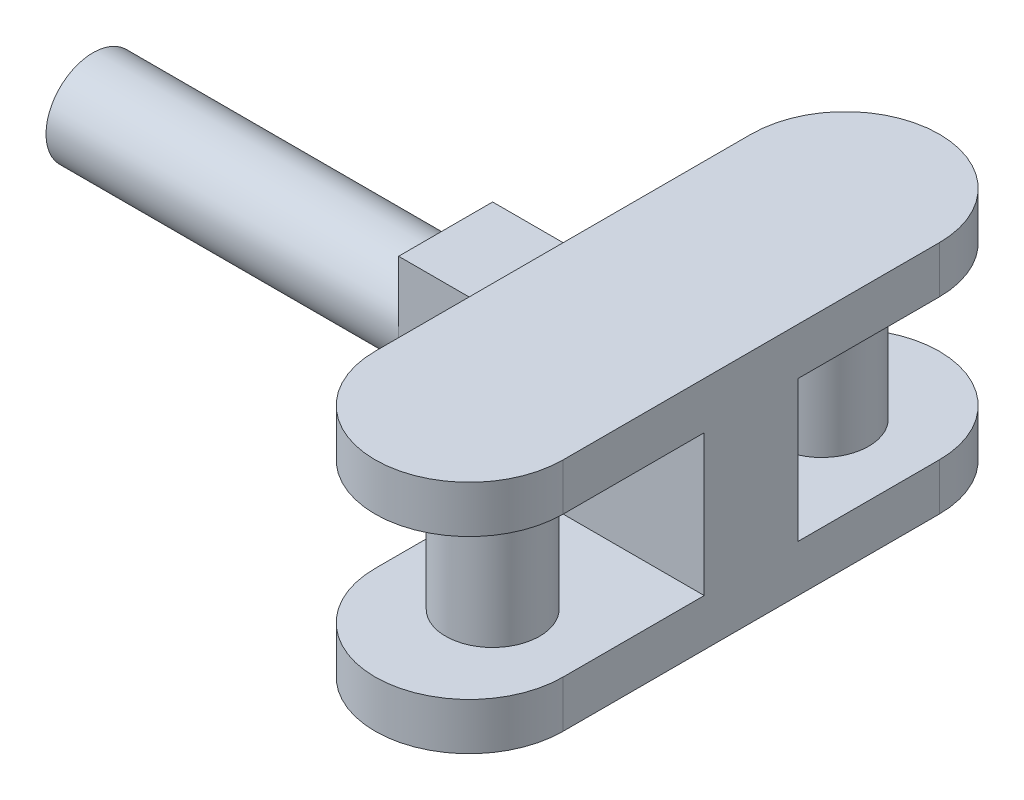
ISO-10303-21;
HEADER;
FILE_DESCRIPTION(('STEP AP214'),'2;1');
FILE_NAME('part.step','',(''),(''),'','','');
FILE_SCHEMA(('AUTOMOTIVE_DESIGN { 1 0 10303 214 1 1 1 1 }'));
ENDSEC;
DATA;
#1=APPLICATION_CONTEXT('core data for automotive mechanical design processes');
#2=APPLICATION_PROTOCOL_DEFINITION('international standard','automotive_design',2000,#1);
#3=PRODUCT_CONTEXT('',#1,'mechanical');
#4=PRODUCT('Part','Part','',(#3));
#5=PRODUCT_RELATED_PRODUCT_CATEGORY('part','',(#4));
#6=PRODUCT_DEFINITION_FORMATION('','',#4);
#7=PRODUCT_DEFINITION_CONTEXT('part definition',#1,'design');
#8=PRODUCT_DEFINITION('design','',#6,#7);
#9=PRODUCT_DEFINITION_SHAPE('','',#8);
#10=(LENGTH_UNIT() NAMED_UNIT(*) SI_UNIT(.MILLI.,.METRE.));
#11=(NAMED_UNIT(*) PLANE_ANGLE_UNIT() SI_UNIT($,.RADIAN.));
#12=(NAMED_UNIT(*) SI_UNIT($,.STERADIAN.) SOLID_ANGLE_UNIT());
#13=UNCERTAINTY_MEASURE_WITH_UNIT(LENGTH_MEASURE(1.E-05),#10,'distance_accuracy_value','');
#14=(GEOMETRIC_REPRESENTATION_CONTEXT(3) GLOBAL_UNCERTAINTY_ASSIGNED_CONTEXT((#13)) GLOBAL_UNIT_ASSIGNED_CONTEXT((#10,
#11,#12)) REPRESENTATION_CONTEXT('',''));
#15=CARTESIAN_POINT('',(0.,0.,0.));
#16=DIRECTION('',(0.,0.,1.));
#17=DIRECTION('',(1.,0.,0.));
#18=AXIS2_PLACEMENT_3D('',#15,#16,#17);
#19=CARTESIAN_POINT('',(0.,10.,0.));
#20=DIRECTION('',(1.,0.,0.));
#21=DIRECTION('',(0.,0.,-1.));
#22=AXIS2_PLACEMENT_3D('',#19,#20,#21);
#23=PLANE('',#22);
#24=DIRECTION('',(0.,0.,1.));
#25=VECTOR('',#24,1.);
#26=CARTESIAN_POINT('',(0.,2.,-14.));
#27=LINE('',#26,#25);
#28=CARTESIAN_POINT('',(0.,2.,-14.));
#29=VERTEX_POINT('',#28);
#30=CARTESIAN_POINT('',(0.,2.,-10.));
#31=VERTEX_POINT('',#30);
#32=EDGE_CURVE('E286',#29,#31,#27,.T.);
#33=ORIENTED_EDGE('',*,*,#32,.F.);
#34=DIRECTION('',(0.,0.,-1.));
#35=VECTOR('',#34,1.);
#36=CARTESIAN_POINT('',(0.,2.,0.));
#37=LINE('',#36,#35);
#38=CARTESIAN_POINT('',(0.,2.,-20.));
#39=VERTEX_POINT('',#38);
#40=EDGE_CURVE('E202',#29,#39,#37,.T.);
#41=ORIENTED_EDGE('',*,*,#40,.T.);
#42=DIRECTION('',(0.,-1.,0.));
#43=VECTOR('',#42,1.);
#44=CARTESIAN_POINT('',(0.,10.,-20.));
#45=LINE('',#44,#43);
#46=CARTESIAN_POINT('',(0.,0.,-20.));
#47=VERTEX_POINT('',#46);
#48=EDGE_CURVE('E232',#39,#47,#45,.T.);
#49=ORIENTED_EDGE('',*,*,#48,.T.);
#50=DIRECTION('',(0.,0.,1.));
#51=VECTOR('',#50,1.);
#52=CARTESIAN_POINT('',(0.,0.,0.));
#53=LINE('',#52,#51);
#54=CARTESIAN_POINT('',(0.,0.,-4.));
#55=VERTEX_POINT('',#54);
#56=EDGE_CURVE('E210',#47,#55,#53,.T.);
#57=ORIENTED_EDGE('',*,*,#56,.T.);
#58=DIRECTION('',(0.,-1.,0.));
#59=VECTOR('',#58,1.);
#60=CARTESIAN_POINT('',(0.,10.,-4.));
#61=LINE('',#60,#59);
#62=CARTESIAN_POINT('',(0.,2.,-4.));
#63=VERTEX_POINT('',#62);
#64=EDGE_CURVE('E263',#55,#63,#61,.F.);
#65=ORIENTED_EDGE('',*,*,#64,.T.);
#66=DIRECTION('',(0.,0.,-1.));
#67=VECTOR('',#66,1.);
#68=CARTESIAN_POINT('',(0.,2.,0.));
#69=LINE('',#68,#67);
#70=EDGE_CURVE('E205',#63,#31,#69,.T.);
#71=ORIENTED_EDGE('',*,*,#70,.T.);
#72=EDGE_LOOP('',(#33,#41,#49,#57,#65,#71));
#73=FACE_BOUND('',#72,.T.);
#74=ADVANCED_FACE('F35',(#73),#23,.F.);
#75=DIRECTION('',(0.,0.,-1.));
#76=VECTOR('',#75,1.);
#77=CARTESIAN_POINT('',(0.,8.,-14.));
#78=LINE('',#77,#76);
#79=CARTESIAN_POINT('',(0.,8.,-10.));
#80=VERTEX_POINT('',#79);
#81=CARTESIAN_POINT('',(0.,8.,-14.));
#82=VERTEX_POINT('',#81);
#83=EDGE_CURVE('E153',#80,#82,#78,.T.);
#84=ORIENTED_EDGE('',*,*,#83,.F.);
#85=DIRECTION('',(0.,0.,1.));
#86=VECTOR('',#85,1.);
#87=CARTESIAN_POINT('',(0.,8.,0.));
#88=LINE('',#87,#86);
#89=CARTESIAN_POINT('',(0.,8.,-4.));
#90=VERTEX_POINT('',#89);
#91=EDGE_CURVE('E207',#80,#90,#88,.T.);
#92=ORIENTED_EDGE('',*,*,#91,.T.);
#93=DIRECTION('',(0.,-1.,0.));
#94=VECTOR('',#93,1.);
#95=CARTESIAN_POINT('',(0.,10.,-4.));
#96=LINE('',#95,#94);
#97=CARTESIAN_POINT('',(0.,10.,-4.));
#98=VERTEX_POINT('',#97);
#99=EDGE_CURVE('E253',#90,#98,#96,.F.);
#100=ORIENTED_EDGE('',*,*,#99,.T.);
#101=DIRECTION('',(0.,0.,1.));
#102=VECTOR('',#101,1.);
#103=CARTESIAN_POINT('',(0.,10.,0.));
#104=LINE('',#103,#102);
#105=CARTESIAN_POINT('',(0.,10.,-20.));
#106=VERTEX_POINT('',#105);
#107=EDGE_CURVE('E211',#106,#98,#104,.T.);
#108=ORIENTED_EDGE('',*,*,#107,.F.);
#109=DIRECTION('',(0.,-1.,0.));
#110=VECTOR('',#109,1.);
#111=CARTESIAN_POINT('',(0.,10.,-20.));
#112=LINE('',#111,#110);
#113=CARTESIAN_POINT('',(0.,8.,-20.));
#114=VERTEX_POINT('',#113);
#115=EDGE_CURVE('E243',#106,#114,#112,.T.);
#116=ORIENTED_EDGE('',*,*,#115,.T.);
#117=DIRECTION('',(0.,0.,1.));
#118=VECTOR('',#117,1.);
#119=CARTESIAN_POINT('',(0.,8.,0.));
#120=LINE('',#119,#118);
#121=EDGE_CURVE('E189',#114,#82,#120,.T.);
#122=ORIENTED_EDGE('',*,*,#121,.T.);
#123=EDGE_LOOP('',(#84,#92,#100,#108,#116,#122));
#124=FACE_BOUND('',#123,.T.);
#125=ADVANCED_FACE('F303',(#124),#23,.F.);
#126=CARTESIAN_POINT('',(4.,0.,-4.));
#127=DIRECTION('',(0.,-1.,0.));
#128=DIRECTION('',(0.,0.,-1.));
#129=AXIS2_PLACEMENT_3D('',#126,#127,#128);
#130=CYLINDRICAL_SURFACE('',#129,4.);
#131=ORIENTED_EDGE('',*,*,#64,.F.);
#132=CARTESIAN_POINT('',(4.,0.,-4.));
#133=DIRECTION('',(0.,-1.,0.));
#134=DIRECTION('',(0.,0.,-1.));
#135=AXIS2_PLACEMENT_3D('',#132,#133,#134);
#136=CIRCLE('',#135,4.);
#137=CARTESIAN_POINT('',(8.,0.,-4.));
#138=VERTEX_POINT('',#137);
#139=EDGE_CURVE('E59',#138,#55,#136,.T.);
#140=ORIENTED_EDGE('',*,*,#139,.F.);
#141=DIRECTION('',(0.,-1.,0.));
#142=VECTOR('',#141,1.);
#143=CARTESIAN_POINT('',(8.,10.,-4.));
#144=LINE('',#143,#142);
#145=CARTESIAN_POINT('',(8.,2.,-4.));
#146=VERTEX_POINT('',#145);
#147=EDGE_CURVE('E266',#146,#138,#144,.T.);
#148=ORIENTED_EDGE('',*,*,#147,.F.);
#149=CARTESIAN_POINT('',(4.,2.,-4.));
#150=DIRECTION('',(0.,-1.,0.));
#151=DIRECTION('',(0.,0.,-1.));
#152=AXIS2_PLACEMENT_3D('',#149,#150,#151);
#153=CIRCLE('',#152,4.);
#154=EDGE_CURVE('E268',#63,#146,#153,.F.);
#155=ORIENTED_EDGE('',*,*,#154,.F.);
#156=EDGE_LOOP('',(#131,#140,#148,#155));
#157=FACE_BOUND('',#156,.T.);
#158=ADVANCED_FACE('F38',(#157),#130,.T.);
#159=CARTESIAN_POINT('',(4.,8.,-4.));
#160=DIRECTION('',(0.,-1.,0.));
#161=DIRECTION('',(0.,0.,-1.));
#162=AXIS2_PLACEMENT_3D('',#159,#160,#161);
#163=CYLINDRICAL_SURFACE('',#162,4.);
#164=ORIENTED_EDGE('',*,*,#99,.F.);
#165=CARTESIAN_POINT('',(4.,8.,-4.));
#166=DIRECTION('',(0.,1.,0.));
#167=DIRECTION('',(0.,0.,1.));
#168=AXIS2_PLACEMENT_3D('',#165,#166,#167);
#169=CIRCLE('',#168,4.);
#170=CARTESIAN_POINT('',(8.,8.,-4.));
#171=VERTEX_POINT('',#170);
#172=EDGE_CURVE('E259',#171,#90,#169,.F.);
#173=ORIENTED_EDGE('',*,*,#172,.F.);
#174=DIRECTION('',(0.,-1.,0.));
#175=VECTOR('',#174,1.);
#176=CARTESIAN_POINT('',(8.,10.,-4.));
#177=LINE('',#176,#175);
#178=CARTESIAN_POINT('',(8.,10.,-4.));
#179=VERTEX_POINT('',#178);
#180=EDGE_CURVE('E256',#179,#171,#177,.T.);
#181=ORIENTED_EDGE('',*,*,#180,.F.);
#182=CARTESIAN_POINT('',(4.,10.,-4.));
#183=DIRECTION('',(0.,-1.,0.));
#184=DIRECTION('',(0.,0.,-1.));
#185=AXIS2_PLACEMENT_3D('',#182,#183,#184);
#186=CIRCLE('',#185,4.);
#187=EDGE_CURVE('E261',#98,#179,#186,.F.);
#188=ORIENTED_EDGE('',*,*,#187,.F.);
#189=EDGE_LOOP('',(#164,#173,#181,#188));
#190=FACE_BOUND('',#189,.T.);
#191=ADVANCED_FACE('F327',(#190),#163,.T.);
#192=CARTESIAN_POINT('',(4.,10.,-20.));
#193=DIRECTION('',(0.,-1.,0.));
#194=DIRECTION('',(0.,0.,-1.));
#195=AXIS2_PLACEMENT_3D('',#192,#193,#194);
#196=CYLINDRICAL_SURFACE('',#195,4.);
#197=ORIENTED_EDGE('',*,*,#115,.F.);
#198=CARTESIAN_POINT('',(4.,10.,-20.));
#199=DIRECTION('',(0.,-1.,0.));
#200=DIRECTION('',(0.,0.,-1.));
#201=AXIS2_PLACEMENT_3D('',#198,#199,#200);
#202=CIRCLE('',#201,4.);
#203=CARTESIAN_POINT('',(8.,10.,-20.));
#204=VERTEX_POINT('',#203);
#205=EDGE_CURVE('E249',#204,#106,#202,.F.);
#206=ORIENTED_EDGE('',*,*,#205,.F.);
#207=DIRECTION('',(0.,-1.,0.));
#208=VECTOR('',#207,1.);
#209=CARTESIAN_POINT('',(8.,10.,-20.));
#210=LINE('',#209,#208);
#211=CARTESIAN_POINT('',(8.,8.,-20.));
#212=VERTEX_POINT('',#211);
#213=EDGE_CURVE('E246',#212,#204,#210,.F.);
#214=ORIENTED_EDGE('',*,*,#213,.F.);
#215=CARTESIAN_POINT('',(4.,8.,-20.));
#216=DIRECTION('',(0.,1.,0.));
#217=DIRECTION('',(0.,0.,1.));
#218=AXIS2_PLACEMENT_3D('',#215,#216,#217);
#219=CIRCLE('',#218,4.);
#220=EDGE_CURVE('E251',#114,#212,#219,.F.);
#221=ORIENTED_EDGE('',*,*,#220,.F.);
#222=EDGE_LOOP('',(#197,#206,#214,#221));
#223=FACE_BOUND('',#222,.T.);
#224=ADVANCED_FACE('F333',(#223),#196,.T.);
#225=CARTESIAN_POINT('',(4.,2.,-20.));
#226=DIRECTION('',(0.,-1.,0.));
#227=DIRECTION('',(0.,0.,-1.));
#228=AXIS2_PLACEMENT_3D('',#225,#226,#227);
#229=CYLINDRICAL_SURFACE('',#228,4.);
#230=ORIENTED_EDGE('',*,*,#48,.F.);
#231=CARTESIAN_POINT('',(4.,2.,-20.));
#232=DIRECTION('',(0.,-1.,0.));
#233=DIRECTION('',(0.,0.,-1.));
#234=AXIS2_PLACEMENT_3D('',#231,#232,#233);
#235=CIRCLE('',#234,4.);
#236=CARTESIAN_POINT('',(8.,2.,-20.));
#237=VERTEX_POINT('',#236);
#238=EDGE_CURVE('E238',#237,#39,#235,.F.);
#239=ORIENTED_EDGE('',*,*,#238,.F.);
#240=DIRECTION('',(0.,-1.,0.));
#241=VECTOR('',#240,1.);
#242=CARTESIAN_POINT('',(8.,10.,-20.));
#243=LINE('',#242,#241);
#244=CARTESIAN_POINT('',(8.,0.,-20.));
#245=VERTEX_POINT('',#244);
#246=EDGE_CURVE('E235',#245,#237,#243,.F.);
#247=ORIENTED_EDGE('',*,*,#246,.F.);
#248=CARTESIAN_POINT('',(4.,0.,-20.));
#249=DIRECTION('',(0.,-1.,0.));
#250=DIRECTION('',(0.,0.,-1.));
#251=AXIS2_PLACEMENT_3D('',#248,#249,#250);
#252=CIRCLE('',#251,4.);
#253=EDGE_CURVE('E240',#47,#245,#252,.T.);
#254=ORIENTED_EDGE('',*,*,#253,.F.);
#255=EDGE_LOOP('',(#230,#239,#247,#254));
#256=FACE_BOUND('',#255,.T.);
#257=ADVANCED_FACE('F335',(#256),#229,.T.);
#258=CARTESIAN_POINT('',(8.,10.,0.));
#259=DIRECTION('',(-1.,0.,0.));
#260=DIRECTION('',(0.,0.,1.));
#261=AXIS2_PLACEMENT_3D('',#258,#259,#260);
#262=PLANE('',#261);
#263=DIRECTION('',(0.,0.,-1.));
#264=VECTOR('',#263,1.);
#265=CARTESIAN_POINT('',(8.,2.,0.));
#266=LINE('',#265,#264);
#267=CARTESIAN_POINT('',(8.,2.,-10.));
#268=VERTEX_POINT('',#267);
#269=EDGE_CURVE('E178',#146,#268,#266,.T.);
#270=ORIENTED_EDGE('',*,*,#269,.F.);
#271=ORIENTED_EDGE('',*,*,#147,.T.);
#272=DIRECTION('',(0.,0.,-1.));
#273=VECTOR('',#272,1.);
#274=CARTESIAN_POINT('',(8.,0.,0.));
#275=LINE('',#274,#273);
#276=EDGE_CURVE('E215',#138,#245,#275,.T.);
#277=ORIENTED_EDGE('',*,*,#276,.T.);
#278=ORIENTED_EDGE('',*,*,#246,.T.);
#279=DIRECTION('',(0.,0.,-1.));
#280=VECTOR('',#279,1.);
#281=CARTESIAN_POINT('',(8.,2.,-24.));
#282=LINE('',#281,#280);
#283=CARTESIAN_POINT('',(8.,2.,-14.));
#284=VERTEX_POINT('',#283);
#285=EDGE_CURVE('E195',#284,#237,#282,.T.);
#286=ORIENTED_EDGE('',*,*,#285,.F.);
#287=DIRECTION('',(0.,-1.,0.));
#288=VECTOR('',#287,1.);
#289=CARTESIAN_POINT('',(8.,8.,-14.));
#290=LINE('',#289,#288);
#291=CARTESIAN_POINT('',(8.,8.,-14.));
#292=VERTEX_POINT('',#291);
#293=EDGE_CURVE('E193',#292,#284,#290,.T.);
#294=ORIENTED_EDGE('',*,*,#293,.F.);
#295=DIRECTION('',(0.,0.,1.));
#296=VECTOR('',#295,1.);
#297=CARTESIAN_POINT('',(8.,8.,-24.));
#298=LINE('',#297,#296);
#299=EDGE_CURVE('E172',#212,#292,#298,.T.);
#300=ORIENTED_EDGE('',*,*,#299,.F.);
#301=ORIENTED_EDGE('',*,*,#213,.T.);
#302=DIRECTION('',(0.,0.,-1.));
#303=VECTOR('',#302,1.);
#304=CARTESIAN_POINT('',(8.,10.,0.));
#305=LINE('',#304,#303);
#306=EDGE_CURVE('E214',#179,#204,#305,.T.);
#307=ORIENTED_EDGE('',*,*,#306,.F.);
#308=ORIENTED_EDGE('',*,*,#180,.T.);
#309=DIRECTION('',(0.,0.,1.));
#310=VECTOR('',#309,1.);
#311=CARTESIAN_POINT('',(8.,8.,0.));
#312=LINE('',#311,#310);
#313=CARTESIAN_POINT('',(8.,8.,-10.));
#314=VERTEX_POINT('',#313);
#315=EDGE_CURVE('E183',#314,#171,#312,.T.);
#316=ORIENTED_EDGE('',*,*,#315,.F.);
#317=DIRECTION('',(0.,1.,0.));
#318=VECTOR('',#317,1.);
#319=CARTESIAN_POINT('',(8.,8.,-10.));
#320=LINE('',#319,#318);
#321=EDGE_CURVE('E180',#268,#314,#320,.T.);
#322=ORIENTED_EDGE('',*,*,#321,.F.);
#323=EDGE_LOOP('',(#270,#271,#277,#278,#286,#294,#300,#301,#307,#308,#316,#322));
#324=FACE_BOUND('',#323,.T.);
#325=ADVANCED_FACE('F315',(#324),#262,.F.);
#326=CARTESIAN_POINT('',(0.,10.,0.));
#327=DIRECTION('',(0.,-1.,0.));
#328=DIRECTION('',(0.,0.,-1.));
#329=AXIS2_PLACEMENT_3D('',#326,#327,#328);
#330=PLANE('',#329);
#331=ORIENTED_EDGE('',*,*,#107,.T.);
#332=ORIENTED_EDGE('',*,*,#187,.T.);
#333=ORIENTED_EDGE('',*,*,#306,.T.);
#334=ORIENTED_EDGE('',*,*,#205,.T.);
#335=EDGE_LOOP('',(#331,#332,#333,#334));
#336=FACE_BOUND('',#335,.T.);
#337=ADVANCED_FACE('F329',(#336),#330,.F.);
#338=CARTESIAN_POINT('',(0.,0.,0.));
#339=DIRECTION('',(0.,-1.,0.));
#340=DIRECTION('',(0.,0.,-1.));
#341=AXIS2_PLACEMENT_3D('',#338,#339,#340);
#342=PLANE('',#341);
#343=ORIENTED_EDGE('',*,*,#276,.F.);
#344=ORIENTED_EDGE('',*,*,#139,.T.);
#345=ORIENTED_EDGE('',*,*,#56,.F.);
#346=ORIENTED_EDGE('',*,*,#253,.T.);
#347=EDGE_LOOP('',(#343,#344,#345,#346));
#348=FACE_BOUND('',#347,.T.);
#349=ADVANCED_FACE('F362',(#348),#342,.T.);
#350=CARTESIAN_POINT('',(-2.,8.,-14.));
#351=DIRECTION('',(0.,0.,1.));
#352=DIRECTION('',(0.,-1.,0.));
#353=AXIS2_PLACEMENT_3D('',#350,#351,#352);
#354=PLANE('',#353);
#355=DIRECTION('',(1.,0.,0.));
#356=VECTOR('',#355,1.);
#357=CARTESIAN_POINT('',(-2.,8.,-14.));
#358=LINE('',#357,#356);
#359=EDGE_CURVE('E198',#82,#292,#358,.T.);
#360=ORIENTED_EDGE('',*,*,#359,.T.);
#361=ORIENTED_EDGE('',*,*,#293,.T.);
#362=DIRECTION('',(1.,0.,0.));
#363=VECTOR('',#362,1.);
#364=CARTESIAN_POINT('',(-2.,2.,-14.));
#365=LINE('',#364,#363);
#366=EDGE_CURVE('E168',#29,#284,#365,.T.);
#367=ORIENTED_EDGE('',*,*,#366,.F.);
#368=DIRECTION('',(1.,0.,0.));
#369=VECTOR('',#368,1.);
#370=CARTESIAN_POINT('',(-5.,2.,-14.));
#371=LINE('',#370,#369);
#372=CARTESIAN_POINT('',(-5.,2.,-14.));
#373=VERTEX_POINT('',#372);
#374=EDGE_CURVE('E159',#373,#29,#371,.T.);
#375=ORIENTED_EDGE('',*,*,#374,.F.);
#376=DIRECTION('',(0.,-1.,0.));
#377=VECTOR('',#376,1.);
#378=CARTESIAN_POINT('',(-5.,8.,-14.));
#379=LINE('',#378,#377);
#380=CARTESIAN_POINT('',(-5.,5.,-14.));
#381=VERTEX_POINT('',#380);
#382=EDGE_CURVE('E142',#381,#373,#379,.T.);
#383=ORIENTED_EDGE('',*,*,#382,.F.);
#384=CARTESIAN_POINT('',(-5.,8.,-14.));
#385=VERTEX_POINT('',#384);
#386=EDGE_CURVE('E152',#385,#381,#379,.T.);
#387=ORIENTED_EDGE('',*,*,#386,.F.);
#388=DIRECTION('',(1.,0.,0.));
#389=VECTOR('',#388,1.);
#390=CARTESIAN_POINT('',(-5.,8.,-14.));
#391=LINE('',#390,#389);
#392=EDGE_CURVE('E285',#385,#82,#391,.T.);
#393=ORIENTED_EDGE('',*,*,#392,.T.);
#394=EDGE_LOOP('',(#360,#361,#367,#375,#383,#387,#393));
#395=FACE_BOUND('',#394,.T.);
#396=ADVANCED_FACE('F166',(#395),#354,.F.);
#397=CARTESIAN_POINT('',(-2.,2.,-24.));
#398=DIRECTION('',(0.,-1.,0.));
#399=DIRECTION('',(0.,0.,-1.));
#400=AXIS2_PLACEMENT_3D('',#397,#398,#399);
#401=PLANE('',#400);
#402=CARTESIAN_POINT('',(4.,2.,-19.));
#403=DIRECTION('',(0.,-1.,0.));
#404=DIRECTION('',(0.,0.,-1.));
#405=AXIS2_PLACEMENT_3D('',#402,#403,#404);
#406=CIRCLE('',#405,2.);
#407=CARTESIAN_POINT('',(4.,2.,-21.));
#408=VERTEX_POINT('',#407);
#409=EDGE_CURVE('E229',#408,#408,#406,.F.);
#410=ORIENTED_EDGE('',*,*,#409,.F.);
#411=EDGE_LOOP('',(#410));
#412=FACE_BOUND('',#411,.T.);
#413=ORIENTED_EDGE('',*,*,#285,.T.);
#414=ORIENTED_EDGE('',*,*,#238,.T.);
#415=ORIENTED_EDGE('',*,*,#40,.F.);
#416=ORIENTED_EDGE('',*,*,#366,.T.);
#417=EDGE_LOOP('',(#413,#414,#415,#416));
#418=FACE_BOUND('',#417,.T.);
#419=ADVANCED_FACE('F318',(#412,#418),#401,.F.);
#420=CARTESIAN_POINT('',(-2.,8.,-24.));
#421=DIRECTION('',(0.,1.,0.));
#422=DIRECTION('',(0.,0.,1.));
#423=AXIS2_PLACEMENT_3D('',#420,#421,#422);
#424=PLANE('',#423);
#425=CARTESIAN_POINT('',(4.,8.,-19.));
#426=DIRECTION('',(0.,1.,0.));
#427=DIRECTION('',(0.,0.,1.));
#428=AXIS2_PLACEMENT_3D('',#425,#426,#427);
#429=CIRCLE('',#428,2.);
#430=CARTESIAN_POINT('',(4.,8.,-17.));
#431=VERTEX_POINT('',#430);
#432=EDGE_CURVE('E226',#431,#431,#429,.F.);
#433=ORIENTED_EDGE('',*,*,#432,.F.);
#434=EDGE_LOOP('',(#433));
#435=FACE_BOUND('',#434,.T.);
#436=ORIENTED_EDGE('',*,*,#121,.F.);
#437=ORIENTED_EDGE('',*,*,#220,.T.);
#438=ORIENTED_EDGE('',*,*,#299,.T.);
#439=ORIENTED_EDGE('',*,*,#359,.F.);
#440=EDGE_LOOP('',(#436,#437,#438,#439));
#441=FACE_BOUND('',#440,.T.);
#442=ADVANCED_FACE('F309',(#435,#441),#424,.F.);
#443=CARTESIAN_POINT('',(-2.,8.,0.));
#444=DIRECTION('',(0.,1.,0.));
#445=DIRECTION('',(0.,0.,1.));
#446=AXIS2_PLACEMENT_3D('',#443,#444,#445);
#447=PLANE('',#446);
#448=CARTESIAN_POINT('',(4.,8.,-5.));
#449=DIRECTION('',(0.,1.,0.));
#450=DIRECTION('',(0.,0.,1.));
#451=AXIS2_PLACEMENT_3D('',#448,#449,#450);
#452=CIRCLE('',#451,2.);
#453=CARTESIAN_POINT('',(4.,8.,-3.));
#454=VERTEX_POINT('',#453);
#455=EDGE_CURVE('E223',#454,#454,#452,.F.);
#456=ORIENTED_EDGE('',*,*,#455,.F.);
#457=EDGE_LOOP('',(#456));
#458=FACE_BOUND('',#457,.T.);
#459=ORIENTED_EDGE('',*,*,#315,.T.);
#460=ORIENTED_EDGE('',*,*,#172,.T.);
#461=ORIENTED_EDGE('',*,*,#91,.F.);
#462=DIRECTION('',(1.,0.,0.));
#463=VECTOR('',#462,1.);
#464=CARTESIAN_POINT('',(-2.,8.,-10.));
#465=LINE('',#464,#463);
#466=EDGE_CURVE('E187',#80,#314,#465,.T.);
#467=ORIENTED_EDGE('',*,*,#466,.T.);
#468=EDGE_LOOP('',(#459,#460,#461,#467));
#469=FACE_BOUND('',#468,.T.);
#470=ADVANCED_FACE('F300',(#458,#469),#447,.F.);
#471=CARTESIAN_POINT('',(-2.,8.,-10.));
#472=DIRECTION('',(0.,0.,-1.));
#473=DIRECTION('',(0.,1.,0.));
#474=AXIS2_PLACEMENT_3D('',#471,#472,#473);
#475=PLANE('',#474);
#476=DIRECTION('',(1.,0.,0.));
#477=VECTOR('',#476,1.);
#478=CARTESIAN_POINT('',(-2.,2.,-10.));
#479=LINE('',#478,#477);
#480=EDGE_CURVE('E186',#31,#268,#479,.T.);
#481=ORIENTED_EDGE('',*,*,#480,.T.);
#482=ORIENTED_EDGE('',*,*,#321,.T.);
#483=ORIENTED_EDGE('',*,*,#466,.F.);
#484=DIRECTION('',(1.,0.,0.));
#485=VECTOR('',#484,1.);
#486=CARTESIAN_POINT('',(-5.,8.,-10.));
#487=LINE('',#486,#485);
#488=CARTESIAN_POINT('',(-5.,8.,-10.));
#489=VERTEX_POINT('',#488);
#490=EDGE_CURVE('E174',#489,#80,#487,.T.);
#491=ORIENTED_EDGE('',*,*,#490,.F.);
#492=DIRECTION('',(0.,1.,0.));
#493=VECTOR('',#492,1.);
#494=CARTESIAN_POINT('',(-5.,8.,-10.));
#495=LINE('',#494,#493);
#496=CARTESIAN_POINT('',(-5.,5.,-10.));
#497=VERTEX_POINT('',#496);
#498=EDGE_CURVE('E162',#497,#489,#495,.T.);
#499=ORIENTED_EDGE('',*,*,#498,.F.);
#500=CARTESIAN_POINT('',(-5.,2.,-10.));
#501=VERTEX_POINT('',#500);
#502=EDGE_CURVE('E51',#501,#497,#495,.T.);
#503=ORIENTED_EDGE('',*,*,#502,.F.);
#504=DIRECTION('',(1.,0.,0.));
#505=VECTOR('',#504,1.);
#506=CARTESIAN_POINT('',(-5.,2.,-10.));
#507=LINE('',#506,#505);
#508=EDGE_CURVE('E161',#501,#31,#507,.T.);
#509=ORIENTED_EDGE('',*,*,#508,.T.);
#510=EDGE_LOOP('',(#481,#482,#483,#491,#499,#503,#509));
#511=FACE_BOUND('',#510,.T.);
#512=ADVANCED_FACE('F295',(#511),#475,.F.);
#513=CARTESIAN_POINT('',(-2.,2.,0.));
#514=DIRECTION('',(0.,-1.,0.));
#515=DIRECTION('',(0.,0.,-1.));
#516=AXIS2_PLACEMENT_3D('',#513,#514,#515);
#517=PLANE('',#516);
#518=CARTESIAN_POINT('',(4.,2.,-5.));
#519=DIRECTION('',(0.,-1.,0.));
#520=DIRECTION('',(0.,0.,-1.));
#521=AXIS2_PLACEMENT_3D('',#518,#519,#520);
#522=CIRCLE('',#521,2.);
#523=CARTESIAN_POINT('',(4.,2.,-7.));
#524=VERTEX_POINT('',#523);
#525=EDGE_CURVE('E217',#524,#524,#522,.F.);
#526=ORIENTED_EDGE('',*,*,#525,.F.);
#527=EDGE_LOOP('',(#526));
#528=FACE_BOUND('',#527,.T.);
#529=ORIENTED_EDGE('',*,*,#70,.F.);
#530=ORIENTED_EDGE('',*,*,#154,.T.);
#531=ORIENTED_EDGE('',*,*,#269,.T.);
#532=ORIENTED_EDGE('',*,*,#480,.F.);
#533=EDGE_LOOP('',(#529,#530,#531,#532));
#534=FACE_BOUND('',#533,.T.);
#535=ADVANCED_FACE('F376',(#528,#534),#517,.F.);
#536=CARTESIAN_POINT('',(4.,8.,-5.));
#537=DIRECTION('',(0.,-1.,0.));
#538=DIRECTION('',(0.,0.,-1.));
#539=AXIS2_PLACEMENT_3D('',#536,#537,#538);
#540=CYLINDRICAL_SURFACE('',#539,2.);
#541=ORIENTED_EDGE('',*,*,#455,.T.);
#542=EDGE_LOOP('',(#541));
#543=FACE_BOUND('',#542,.T.);
#544=ORIENTED_EDGE('',*,*,#525,.T.);
#545=EDGE_LOOP('',(#544));
#546=FACE_BOUND('',#545,.T.);
#547=ADVANCED_FACE('F379',(#543,#546),#540,.T.);
#548=CARTESIAN_POINT('',(4.,8.,-19.));
#549=DIRECTION('',(0.,-1.,0.));
#550=DIRECTION('',(0.,0.,-1.));
#551=AXIS2_PLACEMENT_3D('',#548,#549,#550);
#552=CYLINDRICAL_SURFACE('',#551,2.);
#553=ORIENTED_EDGE('',*,*,#432,.T.);
#554=EDGE_LOOP('',(#553));
#555=FACE_BOUND('',#554,.T.);
#556=ORIENTED_EDGE('',*,*,#409,.T.);
#557=EDGE_LOOP('',(#556));
#558=FACE_BOUND('',#557,.T.);
#559=ADVANCED_FACE('F388',(#555,#558),#552,.T.);
#560=CARTESIAN_POINT('',(-5.,0.,0.));
#561=DIRECTION('',(-1.,0.,0.));
#562=DIRECTION('',(0.,0.,1.));
#563=AXIS2_PLACEMENT_3D('',#560,#561,#562);
#564=PLANE('',#563);
#565=CARTESIAN_POINT('',(-5.,5.,-12.));
#566=DIRECTION('',(-1.,0.,0.));
#567=DIRECTION('',(0.,0.,1.));
#568=AXIS2_PLACEMENT_3D('',#565,#566,#567);
#569=CIRCLE('',#568,2.);
#570=EDGE_CURVE('E11',#497,#381,#569,.T.);
#571=ORIENTED_EDGE('',*,*,#570,.F.);
#572=ORIENTED_EDGE('',*,*,#498,.T.);
#573=DIRECTION('',(0.,0.,-1.));
#574=VECTOR('',#573,1.);
#575=CARTESIAN_POINT('',(-5.,8.,-14.));
#576=LINE('',#575,#574);
#577=EDGE_CURVE('E279',#489,#385,#576,.T.);
#578=ORIENTED_EDGE('',*,*,#577,.T.);
#579=ORIENTED_EDGE('',*,*,#386,.T.);
#580=EDGE_LOOP('',(#571,#572,#578,#579));
#581=FACE_BOUND('',#580,.T.);
#582=ADVANCED_FACE('F276',(#581),#564,.T.);
#583=CARTESIAN_POINT('',(-5.,2.,-14.));
#584=DIRECTION('',(0.,1.,0.));
#585=DIRECTION('',(0.,0.,1.));
#586=AXIS2_PLACEMENT_3D('',#583,#584,#585);
#587=PLANE('',#586);
#588=ORIENTED_EDGE('',*,*,#32,.T.);
#589=ORIENTED_EDGE('',*,*,#508,.F.);
#590=DIRECTION('',(0.,0.,1.));
#591=VECTOR('',#590,1.);
#592=CARTESIAN_POINT('',(-5.,2.,-14.));
#593=LINE('',#592,#591);
#594=EDGE_CURVE('E145',#373,#501,#593,.T.);
#595=ORIENTED_EDGE('',*,*,#594,.F.);
#596=ORIENTED_EDGE('',*,*,#374,.T.);
#597=EDGE_LOOP('',(#588,#589,#595,#596));
#598=FACE_BOUND('',#597,.T.);
#599=ADVANCED_FACE('F158',(#598),#587,.F.);
#600=CARTESIAN_POINT('',(-5.,8.,-14.));
#601=DIRECTION('',(0.,-1.,0.));
#602=DIRECTION('',(0.,0.,-1.));
#603=AXIS2_PLACEMENT_3D('',#600,#601,#602);
#604=PLANE('',#603);
#605=ORIENTED_EDGE('',*,*,#83,.T.);
#606=ORIENTED_EDGE('',*,*,#392,.F.);
#607=ORIENTED_EDGE('',*,*,#577,.F.);
#608=ORIENTED_EDGE('',*,*,#490,.T.);
#609=EDGE_LOOP('',(#605,#606,#607,#608));
#610=FACE_BOUND('',#609,.T.);
#611=ADVANCED_FACE('F292',(#610),#604,.F.);
#612=EDGE_CURVE('E40',#381,#497,#569,.T.);
#613=ORIENTED_EDGE('',*,*,#612,.F.);
#614=ORIENTED_EDGE('',*,*,#382,.T.);
#615=ORIENTED_EDGE('',*,*,#594,.T.);
#616=ORIENTED_EDGE('',*,*,#502,.T.);
#617=EDGE_LOOP('',(#613,#614,#615,#616));
#618=FACE_BOUND('',#617,.T.);
#619=ADVANCED_FACE('F144',(#618),#564,.T.);
#620=CARTESIAN_POINT('',(-20.,5.,-12.));
#621=DIRECTION('',(-1.,0.,0.));
#622=DIRECTION('',(0.,0.,1.));
#623=AXIS2_PLACEMENT_3D('',#620,#621,#622);
#624=PLANE('',#623);
#625=CARTESIAN_POINT('',(-20.,5.,-12.));
#626=DIRECTION('',(-1.,0.,0.));
#627=DIRECTION('',(0.,0.,1.));
#628=AXIS2_PLACEMENT_3D('',#625,#626,#627);
#629=CIRCLE('',#628,2.);
#630=CARTESIAN_POINT('',(-20.,5.,-10.));
#631=VERTEX_POINT('',#630);
#632=EDGE_CURVE('E169',#631,#631,#629,.T.);
#633=ORIENTED_EDGE('',*,*,#632,.T.);
#634=EDGE_LOOP('',(#633));
#635=FACE_BOUND('',#634,.T.);
#636=ADVANCED_FACE('F395',(#635),#624,.T.);
#637=CARTESIAN_POINT('',(-20.,5.,-12.));
#638=DIRECTION('',(1.,0.,0.));
#639=DIRECTION('',(0.,0.,-1.));
#640=AXIS2_PLACEMENT_3D('',#637,#638,#639);
#641=CYLINDRICAL_SURFACE('',#640,2.);
#642=ORIENTED_EDGE('',*,*,#612,.T.);
#643=ORIENTED_EDGE('',*,*,#570,.T.);
#644=EDGE_LOOP('',(#642,#643));
#645=FACE_BOUND('',#644,.T.);
#646=ORIENTED_EDGE('',*,*,#632,.F.);
#647=EDGE_LOOP('',(#646));
#648=FACE_BOUND('',#647,.T.);
#649=ADVANCED_FACE('F272',(#645,#648),#641,.T.);
#650=CLOSED_SHELL('',(#74,#125,#158,#191,#224,#257,#325,#337,#349,#396,#419,#442,#470,#512,#535,
#547,#559,#582,#599,#611,#619,#636,#649));
#651=MANIFOLD_SOLID_BREP('B2',#650);
#652=ADVANCED_BREP_SHAPE_REPRESENTATION('',(#18,#651),#14);
#653=SHAPE_DEFINITION_REPRESENTATION(#9,#652);
ENDSEC;
END-ISO-10303-21;
